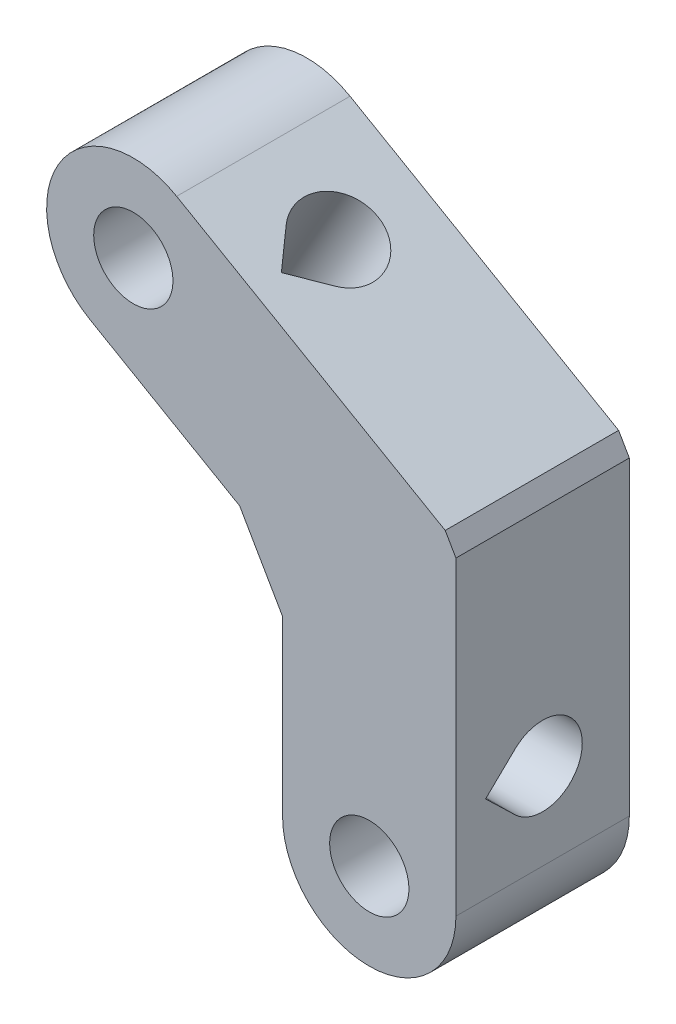
ISO-10303-21;
HEADER;
FILE_DESCRIPTION(('STEP AP214'),'2;1');
FILE_NAME('part.step','',(''),(''),'','','');
FILE_SCHEMA(('AUTOMOTIVE_DESIGN { 1 0 10303 214 1 1 1 1 }'));
ENDSEC;
DATA;
#1=APPLICATION_CONTEXT('core data for automotive mechanical design processes');
#2=APPLICATION_PROTOCOL_DEFINITION('international standard','automotive_design',2000,#1);
#3=PRODUCT_CONTEXT('',#1,'mechanical');
#4=PRODUCT('Part','Part','',(#3));
#5=PRODUCT_RELATED_PRODUCT_CATEGORY('part','',(#4));
#6=PRODUCT_DEFINITION_FORMATION('','',#4);
#7=PRODUCT_DEFINITION_CONTEXT('part definition',#1,'design');
#8=PRODUCT_DEFINITION('design','',#6,#7);
#9=PRODUCT_DEFINITION_SHAPE('','',#8);
#10=(LENGTH_UNIT() NAMED_UNIT(*) SI_UNIT(.MILLI.,.METRE.));
#11=(NAMED_UNIT(*) PLANE_ANGLE_UNIT() SI_UNIT($,.RADIAN.));
#12=(NAMED_UNIT(*) SI_UNIT($,.STERADIAN.) SOLID_ANGLE_UNIT());
#13=UNCERTAINTY_MEASURE_WITH_UNIT(LENGTH_MEASURE(1.E-05),#10,'distance_accuracy_value','');
#14=(GEOMETRIC_REPRESENTATION_CONTEXT(3) GLOBAL_UNCERTAINTY_ASSIGNED_CONTEXT((#13)) GLOBAL_UNIT_ASSIGNED_CONTEXT((#10,
#11,#12)) REPRESENTATION_CONTEXT('',''));
#15=CARTESIAN_POINT('',(0.,0.,0.));
#16=DIRECTION('',(0.,0.,1.));
#17=DIRECTION('',(1.,0.,0.));
#18=AXIS2_PLACEMENT_3D('',#15,#16,#17);
#19=CARTESIAN_POINT('',(0.,0.,0.));
#20=DIRECTION('',(0.,0.,1.));
#21=DIRECTION('',(1.,0.,0.));
#22=AXIS2_PLACEMENT_3D('',#19,#20,#21);
#23=CYLINDRICAL_SURFACE('',#22,7.);
#24=CARTESIAN_POINT('',(0.,0.,14.));
#25=DIRECTION('',(0.,0.,1.));
#26=DIRECTION('',(1.,0.,0.));
#27=AXIS2_PLACEMENT_3D('',#24,#25,#26);
#28=CIRCLE('',#27,7.);
#29=CARTESIAN_POINT('',(-7.,0.,14.));
#30=VERTEX_POINT('',#29);
#31=CARTESIAN_POINT('',(7.,0.,14.));
#32=VERTEX_POINT('',#31);
#33=EDGE_CURVE('E171',#30,#32,#28,.T.);
#34=ORIENTED_EDGE('',*,*,#33,.F.);
#35=DIRECTION('',(0.,0.,1.));
#36=VECTOR('',#35,1.);
#37=CARTESIAN_POINT('',(-7.,0.,0.));
#38=LINE('',#37,#36);
#39=CARTESIAN_POINT('',(-7.,0.,0.));
#40=VERTEX_POINT('',#39);
#41=EDGE_CURVE('E224',#40,#30,#38,.T.);
#42=ORIENTED_EDGE('',*,*,#41,.F.);
#43=CARTESIAN_POINT('',(0.,0.,0.));
#44=DIRECTION('',(0.,0.,1.));
#45=DIRECTION('',(1.,0.,0.));
#46=AXIS2_PLACEMENT_3D('',#43,#44,#45);
#47=CIRCLE('',#46,7.);
#48=CARTESIAN_POINT('',(7.,0.,0.));
#49=VERTEX_POINT('',#48);
#50=EDGE_CURVE('E176',#40,#49,#47,.T.);
#51=ORIENTED_EDGE('',*,*,#50,.T.);
#52=DIRECTION('',(0.,0.,1.));
#53=VECTOR('',#52,1.);
#54=CARTESIAN_POINT('',(7.,0.,0.));
#55=LINE('',#54,#53);
#56=EDGE_CURVE('E201',#49,#32,#55,.T.);
#57=ORIENTED_EDGE('',*,*,#56,.T.);
#58=EDGE_LOOP('',(#34,#42,#51,#57));
#59=FACE_BOUND('',#58,.T.);
#60=ADVANCED_FACE('F31',(#59),#23,.T.);
#61=CARTESIAN_POINT('',(-7.,13.9585481156726,0.));
#62=DIRECTION('',(-1.,0.,0.));
#63=DIRECTION('',(0.,-1.,0.));
#64=AXIS2_PLACEMENT_3D('',#61,#62,#63);
#65=PLANE('',#64);
#66=CARTESIAN_POINT('',(-7.,7.00000000000002,7.));
#67=DIRECTION('',(-1.,0.,0.));
#68=DIRECTION('',(0.,-1.,0.));
#69=AXIS2_PLACEMENT_3D('',#66,#67,#68);
#70=CIRCLE('',#69,3.2);
#71=CARTESIAN_POINT('',(-7.,9.30188736108371,9.22290678546879));
#72=VERTEX_POINT('',#71);
#73=CARTESIAN_POINT('',(-7.,4.69811263891634,9.22290678546879));
#74=VERTEX_POINT('',#73);
#75=EDGE_CURVE('E45',#72,#74,#70,.T.);
#76=ORIENTED_EDGE('',*,*,#75,.F.);
#77=DIRECTION('',(0.,0.694658370458998,-0.719339800338651));
#78=VECTOR('',#77,1.);
#79=CARTESIAN_POINT('',(-7.,7.00000000000002,11.6065809268023));
#80=LINE('',#79,#78);
#81=CARTESIAN_POINT('',(-7.,7.00000000000002,11.6065809268023));
#82=VERTEX_POINT('',#81);
#83=EDGE_CURVE('E145',#82,#72,#80,.T.);
#84=ORIENTED_EDGE('',*,*,#83,.F.);
#85=DIRECTION('',(0.,0.694658370458998,0.719339800338651));
#86=VECTOR('',#85,1.);
#87=CARTESIAN_POINT('',(-7.,4.69811263891633,9.22290678546879));
#88=LINE('',#87,#86);
#89=EDGE_CURVE('E148',#74,#82,#88,.T.);
#90=ORIENTED_EDGE('',*,*,#89,.F.);
#91=EDGE_LOOP('',(#76,#84,#90));
#92=FACE_BOUND('',#91,.T.);
#93=DIRECTION('',(0.,-1.,0.));
#94=VECTOR('',#93,1.);
#95=CARTESIAN_POINT('',(-7.,13.9585481156726,14.));
#96=LINE('',#95,#94);
#97=CARTESIAN_POINT('',(-7.,13.9585481156726,14.));
#98=VERTEX_POINT('',#97);
#99=EDGE_CURVE('E180',#98,#30,#96,.T.);
#100=ORIENTED_EDGE('',*,*,#99,.F.);
#101=DIRECTION('',(0.,0.,1.));
#102=VECTOR('',#101,1.);
#103=CARTESIAN_POINT('',(-7.,13.9585481156726,0.));
#104=LINE('',#103,#102);
#105=CARTESIAN_POINT('',(-7.,13.9585481156726,0.));
#106=VERTEX_POINT('',#105);
#107=EDGE_CURVE('E227',#106,#98,#104,.T.);
#108=ORIENTED_EDGE('',*,*,#107,.F.);
#109=DIRECTION('',(0.,-1.,0.));
#110=VECTOR('',#109,1.);
#111=CARTESIAN_POINT('',(-7.,13.9585481156726,0.));
#112=LINE('',#111,#110);
#113=EDGE_CURVE('E198',#106,#40,#112,.T.);
#114=ORIENTED_EDGE('',*,*,#113,.T.);
#115=ORIENTED_EDGE('',*,*,#41,.T.);
#116=EDGE_LOOP('',(#100,#108,#114,#115));
#117=FACE_BOUND('',#116,.T.);
#118=ADVANCED_FACE('F290',(#92,#117),#65,.T.);
#119=CARTESIAN_POINT('',(-10.4641016151378,19.9585481156726,0.));
#120=DIRECTION('',(-0.866025403784438,-0.500000000000001,0.));
#121=DIRECTION('',(0.500000000000001,-0.866025403784438,0.));
#122=AXIS2_PLACEMENT_3D('',#119,#120,#121);
#123=PLANE('',#122);
#124=DIRECTION('',(0.500000000000001,-0.866025403784438,0.));
#125=VECTOR('',#124,1.);
#126=CARTESIAN_POINT('',(-10.4641016151378,19.9585481156726,14.));
#127=LINE('',#126,#125);
#128=CARTESIAN_POINT('',(-10.4641016151378,19.9585481156726,14.));
#129=VERTEX_POINT('',#128);
#130=EDGE_CURVE('E219',#129,#98,#127,.T.);
#131=ORIENTED_EDGE('',*,*,#130,.F.);
#132=DIRECTION('',(0.,0.,1.));
#133=VECTOR('',#132,1.);
#134=CARTESIAN_POINT('',(-10.4641016151378,19.9585481156726,0.));
#135=LINE('',#134,#133);
#136=CARTESIAN_POINT('',(-10.4641016151378,19.9585481156726,0.));
#137=VERTEX_POINT('',#136);
#138=EDGE_CURVE('E229',#137,#129,#135,.T.);
#139=ORIENTED_EDGE('',*,*,#138,.F.);
#140=DIRECTION('',(0.500000000000001,-0.866025403784438,0.));
#141=VECTOR('',#140,1.);
#142=CARTESIAN_POINT('',(-10.4641016151378,19.9585481156726,0.));
#143=LINE('',#142,#141);
#144=EDGE_CURVE('E195',#137,#106,#143,.T.);
#145=ORIENTED_EDGE('',*,*,#144,.T.);
#146=ORIENTED_EDGE('',*,*,#107,.T.);
#147=EDGE_LOOP('',(#131,#139,#145,#146));
#148=FACE_BOUND('',#147,.T.);
#149=ADVANCED_FACE('F263',(#148),#123,.T.);
#150=CARTESIAN_POINT('',(-22.5525588832577,26.9378221735089,0.));
#151=DIRECTION('',(-0.499999999999998,-0.86602540378444,0.));
#152=DIRECTION('',(0.86602540378444,-0.499999999999998,0.));
#153=AXIS2_PLACEMENT_3D('',#150,#151,#152);
#154=PLANE('',#153);
#155=DIRECTION('',(-0.601591795768995,0.347329185229497,0.719339800338651));
#156=VECTOR('',#155,1.);
#157=CARTESIAN_POINT('',(-14.4968881254178,22.2868784929671,9.22290678546879));
#158=LINE('',#157,#156);
#159=CARTESIAN_POINT('',(-14.4968881254178,22.2868784929671,9.2229067854688));
#160=VERTEX_POINT('',#159);
#161=CARTESIAN_POINT('',(-16.4903810567666,23.4378221735089,11.6065809268023));
#162=VERTEX_POINT('',#161);
#163=EDGE_CURVE('E159',#160,#162,#158,.T.);
#164=ORIENTED_EDGE('',*,*,#163,.F.);
#165=CARTESIAN_POINT('',(-16.4903810567666,23.4378221735089,7.));
#166=DIRECTION('',(-0.499999999999998,-0.86602540378444,0.));
#167=DIRECTION('',(0.86602540378444,-0.499999999999998,0.));
#168=AXIS2_PLACEMENT_3D('',#165,#166,#167);
#169=CIRCLE('',#168,3.2);
#170=CARTESIAN_POINT('',(-18.4838739881154,24.5887658540507,9.22290678546879));
#171=VERTEX_POINT('',#170);
#172=EDGE_CURVE('E165',#171,#160,#169,.T.);
#173=ORIENTED_EDGE('',*,*,#172,.F.);
#174=DIRECTION('',(-0.601591795768994,0.347329185229497,-0.719339800338651));
#175=VECTOR('',#174,1.);
#176=CARTESIAN_POINT('',(-16.4903810567666,23.4378221735089,11.6065809268023));
#177=LINE('',#176,#175);
#178=EDGE_CURVE('E162',#162,#171,#177,.T.);
#179=ORIENTED_EDGE('',*,*,#178,.F.);
#180=EDGE_LOOP('',(#164,#173,#179));
#181=FACE_BOUND('',#180,.T.);
#182=DIRECTION('',(0.86602540378444,-0.499999999999998,0.));
#183=VECTOR('',#182,1.);
#184=CARTESIAN_POINT('',(-22.5525588832577,26.9378221735089,14.));
#185=LINE('',#184,#183);
#186=CARTESIAN_POINT('',(-22.5525588832577,26.9378221735089,14.));
#187=VERTEX_POINT('',#186);
#188=EDGE_CURVE('E216',#187,#129,#185,.T.);
#189=ORIENTED_EDGE('',*,*,#188,.F.);
#190=DIRECTION('',(0.,0.,1.));
#191=VECTOR('',#190,1.);
#192=CARTESIAN_POINT('',(-22.5525588832577,26.9378221735089,0.));
#193=LINE('',#192,#191);
#194=CARTESIAN_POINT('',(-22.5525588832577,26.9378221735089,0.));
#195=VERTEX_POINT('',#194);
#196=EDGE_CURVE('E231',#195,#187,#193,.T.);
#197=ORIENTED_EDGE('',*,*,#196,.F.);
#198=DIRECTION('',(0.86602540378444,-0.499999999999998,0.));
#199=VECTOR('',#198,1.);
#200=CARTESIAN_POINT('',(-22.5525588832577,26.9378221735089,0.));
#201=LINE('',#200,#199);
#202=EDGE_CURVE('E192',#195,#137,#201,.T.);
#203=ORIENTED_EDGE('',*,*,#202,.T.);
#204=ORIENTED_EDGE('',*,*,#138,.T.);
#205=EDGE_LOOP('',(#189,#197,#203,#204));
#206=FACE_BOUND('',#205,.T.);
#207=ADVANCED_FACE('F259',(#181,#206),#154,.T.);
#208=CARTESIAN_POINT('',(-19.0525588832577,33.,0.));
#209=DIRECTION('',(0.,0.,1.));
#210=DIRECTION('',(1.,0.,0.));
#211=AXIS2_PLACEMENT_3D('',#208,#209,#210);
#212=CYLINDRICAL_SURFACE('',#211,7.);
#213=CARTESIAN_POINT('',(-19.0525588832577,33.,14.));
#214=DIRECTION('',(0.,0.,1.));
#215=DIRECTION('',(1.,0.,0.));
#216=AXIS2_PLACEMENT_3D('',#213,#214,#215);
#217=CIRCLE('',#216,7.);
#218=CARTESIAN_POINT('',(-15.5525588832577,39.062177826491,14.));
#219=VERTEX_POINT('',#218);
#220=EDGE_CURVE('E213',#219,#187,#217,.T.);
#221=ORIENTED_EDGE('',*,*,#220,.F.);
#222=DIRECTION('',(0.,0.,1.));
#223=VECTOR('',#222,1.);
#224=CARTESIAN_POINT('',(-15.5525588832577,39.062177826491,0.));
#225=LINE('',#224,#223);
#226=CARTESIAN_POINT('',(-15.5525588832577,39.062177826491,0.));
#227=VERTEX_POINT('',#226);
#228=EDGE_CURVE('E233',#227,#219,#225,.T.);
#229=ORIENTED_EDGE('',*,*,#228,.F.);
#230=CARTESIAN_POINT('',(-19.0525588832577,33.,0.));
#231=DIRECTION('',(0.,0.,1.));
#232=DIRECTION('',(1.,0.,0.));
#233=AXIS2_PLACEMENT_3D('',#230,#231,#232);
#234=CIRCLE('',#233,7.);
#235=EDGE_CURVE('E189',#227,#195,#234,.T.);
#236=ORIENTED_EDGE('',*,*,#235,.T.);
#237=ORIENTED_EDGE('',*,*,#196,.T.);
#238=EDGE_LOOP('',(#221,#229,#236,#237));
#239=FACE_BOUND('',#238,.T.);
#240=ADVANCED_FACE('F262',(#239),#212,.T.);
#241=CARTESIAN_POINT('',(6.13397459621557,26.5414518843274,0.));
#242=DIRECTION('',(0.499999999999998,0.86602540378444,0.));
#243=DIRECTION('',(-0.86602540378444,0.499999999999998,0.));
#244=AXIS2_PLACEMENT_3D('',#241,#242,#243);
#245=PLANE('',#244);
#246=DIRECTION('',(0.601591795768994,-0.347329185229498,-0.719339800338651));
#247=VECTOR('',#246,1.);
#248=CARTESIAN_POINT('',(3.07189108255518,28.3093466252203,-3.41447221264155));
#249=LINE('',#248,#247);
#250=CARTESIAN_POINT('',(-9.4903810567666,35.5621778264911,11.6065809268023));
#251=VERTEX_POINT('',#250);
#252=CARTESIAN_POINT('',(-7.4968881254178,34.4112341459492,9.2229067854688));
#253=VERTEX_POINT('',#252);
#254=EDGE_CURVE('E11',#251,#253,#249,.T.);
#255=ORIENTED_EDGE('',*,*,#254,.F.);
#256=DIRECTION('',(0.601591795768994,-0.347329185229497,0.719339800338651));
#257=VECTOR('',#256,1.);
#258=CARTESIAN_POINT('',(-6.97357969169616,34.1091018808708,14.6159893066616));
#259=LINE('',#258,#257);
#260=CARTESIAN_POINT('',(-11.4838739881154,36.7131215070329,9.22290678546879));
#261=VERTEX_POINT('',#260);
#262=EDGE_CURVE('E226',#261,#251,#259,.T.);
#263=ORIENTED_EDGE('',*,*,#262,.F.);
#264=CARTESIAN_POINT('',(-9.49038105676659,35.5621778264911,7.));
#265=DIRECTION('',(0.499999999999998,0.86602540378444,0.));
#266=DIRECTION('',(-0.86602540378444,0.499999999999998,0.));
#267=AXIS2_PLACEMENT_3D('',#264,#265,#266);
#268=CIRCLE('',#267,3.2);
#269=EDGE_CURVE('E38',#253,#261,#268,.T.);
#270=ORIENTED_EDGE('',*,*,#269,.F.);
#271=EDGE_LOOP('',(#255,#263,#270));
#272=FACE_BOUND('',#271,.T.);
#273=DIRECTION('',(-0.86602540378444,0.499999999999998,0.));
#274=VECTOR('',#273,1.);
#275=CARTESIAN_POINT('',(6.13397459621557,26.5414518843274,14.));
#276=LINE('',#275,#274);
#277=CARTESIAN_POINT('',(6.13397459621557,26.5414518843274,14.));
#278=VERTEX_POINT('',#277);
#279=EDGE_CURVE('E210',#278,#219,#276,.T.);
#280=ORIENTED_EDGE('',*,*,#279,.F.);
#281=DIRECTION('',(0.,0.,1.));
#282=VECTOR('',#281,1.);
#283=CARTESIAN_POINT('',(6.13397459621557,26.5414518843274,0.));
#284=LINE('',#283,#282);
#285=CARTESIAN_POINT('',(6.13397459621557,26.5414518843274,0.));
#286=VERTEX_POINT('',#285);
#287=EDGE_CURVE('E235',#286,#278,#284,.T.);
#288=ORIENTED_EDGE('',*,*,#287,.F.);
#289=DIRECTION('',(-0.86602540378444,0.499999999999998,0.));
#290=VECTOR('',#289,1.);
#291=CARTESIAN_POINT('',(6.13397459621557,26.5414518843274,0.));
#292=LINE('',#291,#290);
#293=EDGE_CURVE('E186',#286,#227,#292,.T.);
#294=ORIENTED_EDGE('',*,*,#293,.T.);
#295=ORIENTED_EDGE('',*,*,#228,.T.);
#296=EDGE_LOOP('',(#280,#288,#294,#295));
#297=FACE_BOUND('',#296,.T.);
#298=ADVANCED_FACE('F248',(#272,#297),#245,.T.);
#299=CARTESIAN_POINT('',(7.,25.0414518843274,0.));
#300=DIRECTION('',(0.866025403784438,0.500000000000001,0.));
#301=DIRECTION('',(-0.500000000000001,0.866025403784438,0.));
#302=AXIS2_PLACEMENT_3D('',#299,#300,#301);
#303=PLANE('',#302);
#304=DIRECTION('',(-0.500000000000001,0.866025403784438,0.));
#305=VECTOR('',#304,1.);
#306=CARTESIAN_POINT('',(7.,25.0414518843274,14.));
#307=LINE('',#306,#305);
#308=CARTESIAN_POINT('',(7.,25.0414518843274,14.));
#309=VERTEX_POINT('',#308);
#310=EDGE_CURVE('E207',#309,#278,#307,.T.);
#311=ORIENTED_EDGE('',*,*,#310,.F.);
#312=DIRECTION('',(0.,0.,1.));
#313=VECTOR('',#312,1.);
#314=CARTESIAN_POINT('',(7.,25.0414518843274,0.));
#315=LINE('',#314,#313);
#316=CARTESIAN_POINT('',(7.,25.0414518843274,0.));
#317=VERTEX_POINT('',#316);
#318=EDGE_CURVE('E237',#317,#309,#315,.T.);
#319=ORIENTED_EDGE('',*,*,#318,.F.);
#320=DIRECTION('',(-0.500000000000001,0.866025403784438,0.));
#321=VECTOR('',#320,1.);
#322=CARTESIAN_POINT('',(7.,25.0414518843274,0.));
#323=LINE('',#322,#321);
#324=EDGE_CURVE('E183',#317,#286,#323,.T.);
#325=ORIENTED_EDGE('',*,*,#324,.T.);
#326=ORIENTED_EDGE('',*,*,#287,.T.);
#327=EDGE_LOOP('',(#311,#319,#325,#326));
#328=FACE_BOUND('',#327,.T.);
#329=ADVANCED_FACE('F282',(#328),#303,.T.);
#330=CARTESIAN_POINT('',(7.,0.,0.));
#331=DIRECTION('',(1.,0.,0.));
#332=DIRECTION('',(0.,1.,0.));
#333=AXIS2_PLACEMENT_3D('',#330,#331,#332);
#334=PLANE('',#333);
#335=CARTESIAN_POINT('',(7.,7.00000000000002,7.));
#336=DIRECTION('',(-1.,0.,0.));
#337=DIRECTION('',(0.,-1.,0.));
#338=AXIS2_PLACEMENT_3D('',#335,#336,#337);
#339=CIRCLE('',#338,3.2);
#340=CARTESIAN_POINT('',(7.,9.3018873610837,9.22290678546879));
#341=VERTEX_POINT('',#340);
#342=CARTESIAN_POINT('',(7.,4.69811263891633,9.22290678546879));
#343=VERTEX_POINT('',#342);
#344=EDGE_CURVE('E132',#341,#343,#339,.T.);
#345=ORIENTED_EDGE('',*,*,#344,.T.);
#346=DIRECTION('',(0.,0.694658370458998,0.719339800338651));
#347=VECTOR('',#346,1.);
#348=CARTESIAN_POINT('',(7.,4.69811263891633,9.22290678546879));
#349=LINE('',#348,#347);
#350=CARTESIAN_POINT('',(7.,7.00000000000002,11.6065809268023));
#351=VERTEX_POINT('',#350);
#352=EDGE_CURVE('E139',#343,#351,#349,.T.);
#353=ORIENTED_EDGE('',*,*,#352,.T.);
#354=DIRECTION('',(0.,0.694658370458998,-0.719339800338651));
#355=VECTOR('',#354,1.);
#356=CARTESIAN_POINT('',(7.,7.00000000000002,11.6065809268023));
#357=LINE('',#356,#355);
#358=EDGE_CURVE('E53',#351,#341,#357,.T.);
#359=ORIENTED_EDGE('',*,*,#358,.T.);
#360=EDGE_LOOP('',(#345,#353,#359));
#361=FACE_BOUND('',#360,.T.);
#362=DIRECTION('',(0.,1.,0.));
#363=VECTOR('',#362,1.);
#364=CARTESIAN_POINT('',(7.,0.,14.));
#365=LINE('',#364,#363);
#366=EDGE_CURVE('E204',#32,#309,#365,.T.);
#367=ORIENTED_EDGE('',*,*,#366,.F.);
#368=ORIENTED_EDGE('',*,*,#56,.F.);
#369=DIRECTION('',(0.,1.,0.));
#370=VECTOR('',#369,1.);
#371=CARTESIAN_POINT('',(7.,0.,0.));
#372=LINE('',#371,#370);
#373=EDGE_CURVE('E179',#49,#317,#372,.T.);
#374=ORIENTED_EDGE('',*,*,#373,.T.);
#375=ORIENTED_EDGE('',*,*,#318,.T.);
#376=EDGE_LOOP('',(#367,#368,#374,#375));
#377=FACE_BOUND('',#376,.T.);
#378=ADVANCED_FACE('F143',(#361,#377),#334,.T.);
#379=CARTESIAN_POINT('',(0.,0.,0.));
#380=DIRECTION('',(0.,0.,1.));
#381=DIRECTION('',(1.,0.,0.));
#382=AXIS2_PLACEMENT_3D('',#379,#380,#381);
#383=PLANE('',#382);
#384=CARTESIAN_POINT('',(-19.0525,32.999898011206,0.));
#385=DIRECTION('',(0.,0.,-1.));
#386=DIRECTION('',(-1.,0.,0.));
#387=AXIS2_PLACEMENT_3D('',#384,#385,#386);
#388=CIRCLE('',#387,3.20000000000001);
#389=CARTESIAN_POINT('',(-22.2525,32.999898011206,0.));
#390=VERTEX_POINT('',#389);
#391=EDGE_CURVE('E444',#390,#390,#388,.T.);
#392=ORIENTED_EDGE('',*,*,#391,.F.);
#393=EDGE_LOOP('',(#392));
#394=FACE_BOUND('',#393,.T.);
#395=CARTESIAN_POINT('',(0.,0.,0.));
#396=DIRECTION('',(0.,0.,-1.));
#397=DIRECTION('',(-1.,0.,0.));
#398=AXIS2_PLACEMENT_3D('',#395,#396,#397);
#399=CIRCLE('',#398,3.20000000000001);
#400=CARTESIAN_POINT('',(-3.20000000000001,0.,0.));
#401=VERTEX_POINT('',#400);
#402=EDGE_CURVE('E446',#401,#401,#399,.T.);
#403=ORIENTED_EDGE('',*,*,#402,.F.);
#404=EDGE_LOOP('',(#403));
#405=FACE_BOUND('',#404,.T.);
#406=ORIENTED_EDGE('',*,*,#50,.F.);
#407=ORIENTED_EDGE('',*,*,#113,.F.);
#408=ORIENTED_EDGE('',*,*,#144,.F.);
#409=ORIENTED_EDGE('',*,*,#202,.F.);
#410=ORIENTED_EDGE('',*,*,#235,.F.);
#411=ORIENTED_EDGE('',*,*,#293,.F.);
#412=ORIENTED_EDGE('',*,*,#324,.F.);
#413=ORIENTED_EDGE('',*,*,#373,.F.);
#414=EDGE_LOOP('',(#406,#407,#408,#409,#410,#411,#412,#413));
#415=FACE_BOUND('',#414,.T.);
#416=ADVANCED_FACE('F277',(#394,#405,#415),#383,.F.);
#417=CARTESIAN_POINT('',(0.,0.,14.));
#418=DIRECTION('',(0.,0.,1.));
#419=DIRECTION('',(1.,0.,0.));
#420=AXIS2_PLACEMENT_3D('',#417,#418,#419);
#421=PLANE('',#420);
#422=CARTESIAN_POINT('',(-19.0525,32.999898011206,14.));
#423=DIRECTION('',(0.,0.,-1.));
#424=DIRECTION('',(-1.,0.,0.));
#425=AXIS2_PLACEMENT_3D('',#422,#423,#424);
#426=CIRCLE('',#425,3.20000000000001);
#427=CARTESIAN_POINT('',(-22.2525,32.999898011206,14.));
#428=VERTEX_POINT('',#427);
#429=EDGE_CURVE('E441',#428,#428,#426,.T.);
#430=ORIENTED_EDGE('',*,*,#429,.T.);
#431=EDGE_LOOP('',(#430));
#432=FACE_BOUND('',#431,.T.);
#433=CARTESIAN_POINT('',(0.,0.,14.));
#434=DIRECTION('',(0.,0.,-1.));
#435=DIRECTION('',(-1.,0.,0.));
#436=AXIS2_PLACEMENT_3D('',#433,#434,#435);
#437=CIRCLE('',#436,3.20000000000001);
#438=CARTESIAN_POINT('',(-3.20000000000001,0.,14.));
#439=VERTEX_POINT('',#438);
#440=EDGE_CURVE('E151',#439,#439,#437,.T.);
#441=ORIENTED_EDGE('',*,*,#440,.T.);
#442=EDGE_LOOP('',(#441));
#443=FACE_BOUND('',#442,.T.);
#444=ORIENTED_EDGE('',*,*,#33,.T.);
#445=ORIENTED_EDGE('',*,*,#366,.T.);
#446=ORIENTED_EDGE('',*,*,#310,.T.);
#447=ORIENTED_EDGE('',*,*,#279,.T.);
#448=ORIENTED_EDGE('',*,*,#220,.T.);
#449=ORIENTED_EDGE('',*,*,#188,.T.);
#450=ORIENTED_EDGE('',*,*,#130,.T.);
#451=ORIENTED_EDGE('',*,*,#99,.T.);
#452=EDGE_LOOP('',(#444,#445,#446,#447,#448,#449,#450,#451));
#453=FACE_BOUND('',#452,.T.);
#454=ADVANCED_FACE('F270',(#432,#443,#453),#421,.T.);
#455=CARTESIAN_POINT('',(-1.4526594913579,44.8801452327037,9.22290678546879));
#456=DIRECTION('',(0.622966541046498,-0.359669900169324,0.694658370458998));
#457=DIRECTION('',(0.744479207661403,0.,-0.667645646552008));
#458=AXIS2_PLACEMENT_3D('',#455,#456,#457);
#459=PLANE('',#458);
#460=ORIENTED_EDGE('',*,*,#254,.T.);
#461=DIRECTION('',(-0.499999999999998,-0.86602540378444,0.));
#462=VECTOR('',#461,1.);
#463=CARTESIAN_POINT('',(-1.45265949135789,44.8801452327037,9.2229067854688));
#464=LINE('',#463,#462);
#465=EDGE_CURVE('E169',#253,#160,#464,.T.);
#466=ORIENTED_EDGE('',*,*,#465,.T.);
#467=ORIENTED_EDGE('',*,*,#163,.T.);
#468=DIRECTION('',(-0.499999999999998,-0.86602540378444,0.));
#469=VECTOR('',#468,1.);
#470=CARTESIAN_POINT('',(-3.44615242270669,46.0310889132455,11.6065809268023));
#471=LINE('',#470,#469);
#472=EDGE_CURVE('E168',#251,#162,#471,.T.);
#473=ORIENTED_EDGE('',*,*,#472,.F.);
#474=EDGE_LOOP('',(#460,#466,#467,#473));
#475=FACE_BOUND('',#474,.T.);
#476=ADVANCED_FACE('F255',(#475),#459,.F.);
#477=CARTESIAN_POINT('',(-3.44615242270669,46.0310889132455,7.));
#478=DIRECTION('',(-0.499999999999998,-0.86602540378444,0.));
#479=DIRECTION('',(0.86602540378444,-0.499999999999998,0.));
#480=AXIS2_PLACEMENT_3D('',#477,#478,#479);
#481=CYLINDRICAL_SURFACE('',#480,3.2);
#482=ORIENTED_EDGE('',*,*,#269,.T.);
#483=DIRECTION('',(-0.499999999999998,-0.86602540378444,0.));
#484=VECTOR('',#483,1.);
#485=CARTESIAN_POINT('',(-5.43964535405549,47.1820325937873,9.22290678546879));
#486=LINE('',#485,#484);
#487=EDGE_CURVE('E172',#261,#171,#486,.T.);
#488=ORIENTED_EDGE('',*,*,#487,.T.);
#489=ORIENTED_EDGE('',*,*,#172,.T.);
#490=ORIENTED_EDGE('',*,*,#465,.F.);
#491=EDGE_LOOP('',(#482,#488,#489,#490));
#492=FACE_BOUND('',#491,.T.);
#493=ADVANCED_FACE('F245',(#492),#481,.F.);
#494=CARTESIAN_POINT('',(-3.44615242270669,46.0310889132455,11.6065809268023));
#495=DIRECTION('',(-0.622966541046499,0.359669900169324,0.694658370458997));
#496=DIRECTION('',(0.744479207661403,0.,0.667645646552009));
#497=AXIS2_PLACEMENT_3D('',#494,#495,#496);
#498=PLANE('',#497);
#499=ORIENTED_EDGE('',*,*,#262,.T.);
#500=ORIENTED_EDGE('',*,*,#472,.T.);
#501=ORIENTED_EDGE('',*,*,#178,.T.);
#502=ORIENTED_EDGE('',*,*,#487,.F.);
#503=EDGE_LOOP('',(#499,#500,#501,#502));
#504=FACE_BOUND('',#503,.T.);
#505=ADVANCED_FACE('F252',(#504),#498,.F.);
#506=CARTESIAN_POINT('',(7.,7.00000000000002,7.));
#507=DIRECTION('',(-1.,0.,0.));
#508=DIRECTION('',(0.,-1.,0.));
#509=AXIS2_PLACEMENT_3D('',#506,#507,#508);
#510=CYLINDRICAL_SURFACE('',#509,3.2);
#511=ORIENTED_EDGE('',*,*,#75,.T.);
#512=DIRECTION('',(-1.,0.,0.));
#513=VECTOR('',#512,1.);
#514=CARTESIAN_POINT('',(7.,4.69811263891633,9.22290678546879));
#515=LINE('',#514,#513);
#516=EDGE_CURVE('E128',#343,#74,#515,.T.);
#517=ORIENTED_EDGE('',*,*,#516,.F.);
#518=ORIENTED_EDGE('',*,*,#344,.F.);
#519=DIRECTION('',(-1.,0.,0.));
#520=VECTOR('',#519,1.);
#521=CARTESIAN_POINT('',(7.,9.3018873610837,9.22290678546879));
#522=LINE('',#521,#520);
#523=EDGE_CURVE('E157',#341,#72,#522,.T.);
#524=ORIENTED_EDGE('',*,*,#523,.T.);
#525=EDGE_LOOP('',(#511,#517,#518,#524));
#526=FACE_BOUND('',#525,.T.);
#527=ADVANCED_FACE('F130',(#526),#510,.F.);
#528=CARTESIAN_POINT('',(7.,7.00000000000002,11.6065809268023));
#529=DIRECTION('',(0.,0.71933980033865,0.694658370458998));
#530=DIRECTION('',(0.,-0.694658370458998,0.71933980033865));
#531=AXIS2_PLACEMENT_3D('',#528,#529,#530);
#532=PLANE('',#531);
#533=ORIENTED_EDGE('',*,*,#83,.T.);
#534=ORIENTED_EDGE('',*,*,#523,.F.);
#535=ORIENTED_EDGE('',*,*,#358,.F.);
#536=DIRECTION('',(-1.,0.,0.));
#537=VECTOR('',#536,1.);
#538=CARTESIAN_POINT('',(7.,7.00000000000002,11.6065809268023));
#539=LINE('',#538,#537);
#540=EDGE_CURVE('E136',#351,#82,#539,.T.);
#541=ORIENTED_EDGE('',*,*,#540,.T.);
#542=EDGE_LOOP('',(#533,#534,#535,#541));
#543=FACE_BOUND('',#542,.T.);
#544=ADVANCED_FACE('F332',(#543),#532,.F.);
#545=CARTESIAN_POINT('',(7.,4.69811263891633,9.22290678546879));
#546=DIRECTION('',(0.,-0.71933980033865,0.694658370458998));
#547=DIRECTION('',(0.,-0.694658370458998,-0.71933980033865));
#548=AXIS2_PLACEMENT_3D('',#545,#546,#547);
#549=PLANE('',#548);
#550=ORIENTED_EDGE('',*,*,#89,.T.);
#551=ORIENTED_EDGE('',*,*,#540,.F.);
#552=ORIENTED_EDGE('',*,*,#352,.F.);
#553=ORIENTED_EDGE('',*,*,#516,.T.);
#554=EDGE_LOOP('',(#550,#551,#552,#553));
#555=FACE_BOUND('',#554,.T.);
#556=ADVANCED_FACE('F140',(#555),#549,.F.);
#557=CARTESIAN_POINT('',(0.,0.,0.));
#558=DIRECTION('',(0.,0.,-1.));
#559=DIRECTION('',(-1.,0.,0.));
#560=AXIS2_PLACEMENT_3D('',#557,#558,#559);
#561=CYLINDRICAL_SURFACE('',#560,3.20000000000001);
#562=ORIENTED_EDGE('',*,*,#440,.F.);
#563=EDGE_LOOP('',(#562));
#564=FACE_BOUND('',#563,.T.);
#565=ORIENTED_EDGE('',*,*,#402,.T.);
#566=EDGE_LOOP('',(#565));
#567=FACE_BOUND('',#566,.T.);
#568=ADVANCED_FACE('F349',(#564,#567),#561,.F.);
#569=CARTESIAN_POINT('',(-19.0525,32.999898011206,0.));
#570=DIRECTION('',(0.,0.,-1.));
#571=DIRECTION('',(-1.,0.,0.));
#572=AXIS2_PLACEMENT_3D('',#569,#570,#571);
#573=CYLINDRICAL_SURFACE('',#572,3.20000000000001);
#574=ORIENTED_EDGE('',*,*,#429,.F.);
#575=EDGE_LOOP('',(#574));
#576=FACE_BOUND('',#575,.T.);
#577=ORIENTED_EDGE('',*,*,#391,.T.);
#578=EDGE_LOOP('',(#577));
#579=FACE_BOUND('',#578,.T.);
#580=ADVANCED_FACE('F358',(#576,#579),#573,.F.);
#581=CLOSED_SHELL('',(#60,#118,#149,#207,#240,#298,#329,#378,#416,#454,#476,#493,#505,#527,#544,
#556,#568,#580));
#582=MANIFOLD_SOLID_BREP('B2',#581);
#583=ADVANCED_BREP_SHAPE_REPRESENTATION('',(#18,#582),#14);
#584=SHAPE_DEFINITION_REPRESENTATION(#9,#583);
ENDSEC;
END-ISO-10303-21;
